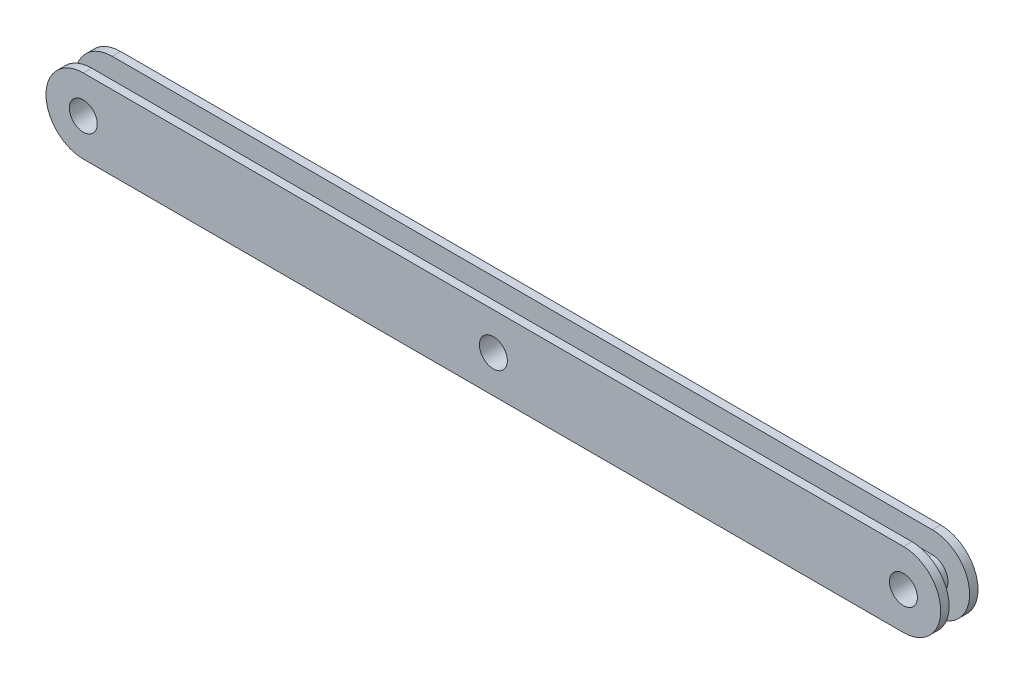
ISO-10303-21;
HEADER;
FILE_DESCRIPTION(('STEP AP214'),'2;1');
FILE_NAME('part.step','',(''),(''),'','','');
FILE_SCHEMA(('AUTOMOTIVE_DESIGN { 1 0 10303 214 1 1 1 1 }'));
ENDSEC;
DATA;
#1=APPLICATION_CONTEXT('core data for automotive mechanical design processes');
#2=APPLICATION_PROTOCOL_DEFINITION('international standard','automotive_design',2000,#1);
#3=PRODUCT_CONTEXT('',#1,'mechanical');
#4=PRODUCT('Part','Part','',(#3));
#5=PRODUCT_RELATED_PRODUCT_CATEGORY('part','',(#4));
#6=PRODUCT_DEFINITION_FORMATION('','',#4);
#7=PRODUCT_DEFINITION_CONTEXT('part definition',#1,'design');
#8=PRODUCT_DEFINITION('design','',#6,#7);
#9=PRODUCT_DEFINITION_SHAPE('','',#8);
#10=(LENGTH_UNIT() NAMED_UNIT(*) SI_UNIT(.MILLI.,.METRE.));
#11=(NAMED_UNIT(*) PLANE_ANGLE_UNIT() SI_UNIT($,.RADIAN.));
#12=(NAMED_UNIT(*) SI_UNIT($,.STERADIAN.) SOLID_ANGLE_UNIT());
#13=UNCERTAINTY_MEASURE_WITH_UNIT(LENGTH_MEASURE(1.E-05),#10,'distance_accuracy_value','');
#14=(GEOMETRIC_REPRESENTATION_CONTEXT(3) GLOBAL_UNCERTAINTY_ASSIGNED_CONTEXT((#13)) GLOBAL_UNIT_ASSIGNED_CONTEXT((#10,
#11,#12)) REPRESENTATION_CONTEXT('',''));
#15=CARTESIAN_POINT('',(0.,0.,0.));
#16=DIRECTION('',(0.,0.,1.));
#17=DIRECTION('',(1.,0.,0.));
#18=AXIS2_PLACEMENT_3D('',#15,#16,#17);
#19=CARTESIAN_POINT('',(0.,0.,-6.35));
#20=DIRECTION('',(0.,-1.,0.));
#21=DIRECTION('',(1.,0.,0.));
#22=AXIS2_PLACEMENT_3D('',#19,#20,#21);
#23=PLANE('',#22);
#24=DIRECTION('',(0.,0.,1.));
#25=VECTOR('',#24,1.);
#26=CARTESIAN_POINT('',(-146.05,0.,-6.35));
#27=LINE('',#26,#25);
#28=CARTESIAN_POINT('',(-146.05,0.,-1.427499939));
#29=VERTEX_POINT('',#28);
#30=CARTESIAN_POINT('',(-146.05,0.,0.));
#31=VERTEX_POINT('',#30);
#32=EDGE_CURVE('E137',#29,#31,#27,.T.);
#33=ORIENTED_EDGE('',*,*,#32,.F.);
#34=DIRECTION('',(1.,0.,0.));
#35=VECTOR('',#34,1.);
#36=CARTESIAN_POINT('',(-152.4,0.,-1.427499939));
#37=LINE('',#36,#35);
#38=CARTESIAN_POINT('',(-6.35000000000005,0.,-1.427499939));
#39=VERTEX_POINT('',#38);
#40=EDGE_CURVE('E225',#29,#39,#37,.T.);
#41=ORIENTED_EDGE('',*,*,#40,.T.);
#42=DIRECTION('',(0.,0.,1.));
#43=VECTOR('',#42,1.);
#44=CARTESIAN_POINT('',(-6.34999999999999,0.,-6.35));
#45=LINE('',#44,#43);
#46=CARTESIAN_POINT('',(-6.34999999999999,0.,0.));
#47=VERTEX_POINT('',#46);
#48=EDGE_CURVE('E289',#39,#47,#45,.T.);
#49=ORIENTED_EDGE('',*,*,#48,.T.);
#50=DIRECTION('',(1.,0.,0.));
#51=VECTOR('',#50,1.);
#52=CARTESIAN_POINT('',(0.,0.,0.));
#53=LINE('',#52,#51);
#54=EDGE_CURVE('E274',#31,#47,#53,.T.);
#55=ORIENTED_EDGE('',*,*,#54,.F.);
#56=EDGE_LOOP('',(#33,#41,#49,#55));
#57=FACE_BOUND('',#56,.T.);
#58=ADVANCED_FACE('F122',(#57),#23,.T.);
#59=CARTESIAN_POINT('',(-6.34999999999999,0.,-6.35));
#60=VERTEX_POINT('',#59);
#61=CARTESIAN_POINT('',(-6.35000000000005,0.,-4.922500061));
#62=VERTEX_POINT('',#61);
#63=EDGE_CURVE('E221',#60,#62,#45,.T.);
#64=ORIENTED_EDGE('',*,*,#63,.T.);
#65=DIRECTION('',(1.,0.,0.));
#66=VECTOR('',#65,1.);
#67=CARTESIAN_POINT('',(-152.4,0.,-4.922500061));
#68=LINE('',#67,#66);
#69=CARTESIAN_POINT('',(-146.05,0.,-4.922500061));
#70=VERTEX_POINT('',#69);
#71=EDGE_CURVE('E213',#70,#62,#68,.T.);
#72=ORIENTED_EDGE('',*,*,#71,.F.);
#73=CARTESIAN_POINT('',(-146.05,0.,-6.35));
#74=VERTEX_POINT('',#73);
#75=EDGE_CURVE('E218',#74,#70,#27,.T.);
#76=ORIENTED_EDGE('',*,*,#75,.F.);
#77=DIRECTION('',(1.,0.,0.));
#78=VECTOR('',#77,1.);
#79=CARTESIAN_POINT('',(0.,0.,-6.35));
#80=LINE('',#79,#78);
#81=EDGE_CURVE('E273',#74,#60,#80,.T.);
#82=ORIENTED_EDGE('',*,*,#81,.T.);
#83=EDGE_LOOP('',(#64,#72,#76,#82));
#84=FACE_BOUND('',#83,.T.);
#85=ADVANCED_FACE('F215',(#84),#23,.T.);
#86=CARTESIAN_POINT('',(-152.4,12.7,-6.35));
#87=DIRECTION('',(0.,1.,0.));
#88=DIRECTION('',(-1.,0.,0.));
#89=AXIS2_PLACEMENT_3D('',#86,#87,#88);
#90=PLANE('',#89);
#91=DIRECTION('',(1.,0.,0.));
#92=VECTOR('',#91,1.);
#93=CARTESIAN_POINT('',(-152.4,12.7,-1.427499939));
#94=LINE('',#93,#92);
#95=CARTESIAN_POINT('',(-146.05,12.7,-1.427499939));
#96=VERTEX_POINT('',#95);
#97=CARTESIAN_POINT('',(-6.35000000000008,12.7,-1.427499939));
#98=VERTEX_POINT('',#97);
#99=EDGE_CURVE('E285',#96,#98,#94,.T.);
#100=ORIENTED_EDGE('',*,*,#99,.F.);
#101=DIRECTION('',(0.,0.,1.));
#102=VECTOR('',#101,1.);
#103=CARTESIAN_POINT('',(-146.05,12.7,-6.35));
#104=LINE('',#103,#102);
#105=CARTESIAN_POINT('',(-146.05,12.7,0.));
#106=VERTEX_POINT('',#105);
#107=EDGE_CURVE('E294',#96,#106,#104,.T.);
#108=ORIENTED_EDGE('',*,*,#107,.T.);
#109=DIRECTION('',(-1.,0.,0.));
#110=VECTOR('',#109,1.);
#111=CARTESIAN_POINT('',(-152.4,12.7,0.));
#112=LINE('',#111,#110);
#113=CARTESIAN_POINT('',(-6.35,12.7,0.));
#114=VERTEX_POINT('',#113);
#115=EDGE_CURVE('E250',#114,#106,#112,.T.);
#116=ORIENTED_EDGE('',*,*,#115,.F.);
#117=DIRECTION('',(0.,0.,1.));
#118=VECTOR('',#117,1.);
#119=CARTESIAN_POINT('',(-6.35,12.7,-6.35));
#120=LINE('',#119,#118);
#121=EDGE_CURVE('E145',#98,#114,#120,.T.);
#122=ORIENTED_EDGE('',*,*,#121,.F.);
#123=EDGE_LOOP('',(#100,#108,#116,#122));
#124=FACE_BOUND('',#123,.T.);
#125=ADVANCED_FACE('F363',(#124),#90,.T.);
#126=CARTESIAN_POINT('',(-6.35,6.34999999999998,-6.35));
#127=DIRECTION('',(0.,0.,1.));
#128=DIRECTION('',(1.,0.,0.));
#129=AXIS2_PLACEMENT_3D('',#126,#127,#128);
#130=CYLINDRICAL_SURFACE('',#129,6.35);
#131=CARTESIAN_POINT('',(-6.35,6.34999999999998,-4.922500061));
#132=DIRECTION('',(0.,0.,1.));
#133=DIRECTION('',(1.,0.,0.));
#134=AXIS2_PLACEMENT_3D('',#131,#132,#133);
#135=CIRCLE('',#134,6.35);
#136=CARTESIAN_POINT('',(-6.35000000000008,12.7,-4.922500061));
#137=VERTEX_POINT('',#136);
#138=EDGE_CURVE('E12',#62,#137,#135,.T.);
#139=ORIENTED_EDGE('',*,*,#138,.F.);
#140=ORIENTED_EDGE('',*,*,#63,.F.);
#141=CARTESIAN_POINT('',(-6.35,6.34999999999998,-6.35));
#142=DIRECTION('',(0.,0.,1.));
#143=DIRECTION('',(1.,0.,0.));
#144=AXIS2_PLACEMENT_3D('',#141,#142,#143);
#145=CIRCLE('',#144,6.35);
#146=CARTESIAN_POINT('',(-6.35,12.7,-6.35));
#147=VERTEX_POINT('',#146);
#148=EDGE_CURVE('E241',#147,#60,#145,.F.);
#149=ORIENTED_EDGE('',*,*,#148,.F.);
#150=EDGE_CURVE('E256',#147,#137,#120,.T.);
#151=ORIENTED_EDGE('',*,*,#150,.T.);
#152=EDGE_LOOP('',(#139,#140,#149,#151));
#153=FACE_BOUND('',#152,.T.);
#154=ADVANCED_FACE('F381',(#153),#130,.T.);
#155=CARTESIAN_POINT('',(-6.35,6.34999999999998,-1.427499939));
#156=DIRECTION('',(0.,0.,-1.));
#157=DIRECTION('',(-1.,0.,0.));
#158=AXIS2_PLACEMENT_3D('',#155,#156,#157);
#159=CIRCLE('',#158,6.35);
#160=EDGE_CURVE('E130',#98,#39,#159,.T.);
#161=ORIENTED_EDGE('',*,*,#160,.F.);
#162=ORIENTED_EDGE('',*,*,#121,.T.);
#163=CARTESIAN_POINT('',(-6.35,6.34999999999998,0.));
#164=DIRECTION('',(0.,0.,1.));
#165=DIRECTION('',(1.,0.,0.));
#166=AXIS2_PLACEMENT_3D('',#163,#164,#165);
#167=CIRCLE('',#166,6.35);
#168=EDGE_CURVE('E239',#114,#47,#167,.F.);
#169=ORIENTED_EDGE('',*,*,#168,.T.);
#170=ORIENTED_EDGE('',*,*,#48,.F.);
#171=EDGE_LOOP('',(#161,#162,#169,#170));
#172=FACE_BOUND('',#171,.T.);
#173=ADVANCED_FACE('F291',(#172),#130,.T.);
#174=CARTESIAN_POINT('',(-146.05,6.34999999999998,-6.35));
#175=DIRECTION('',(0.,0.,1.));
#176=DIRECTION('',(1.,0.,0.));
#177=AXIS2_PLACEMENT_3D('',#174,#175,#176);
#178=CYLINDRICAL_SURFACE('',#177,6.35);
#179=ORIENTED_EDGE('',*,*,#75,.T.);
#180=CARTESIAN_POINT('',(-146.05,6.34999999999998,-4.922500061));
#181=DIRECTION('',(0.,0.,1.));
#182=DIRECTION('',(1.,0.,0.));
#183=AXIS2_PLACEMENT_3D('',#180,#181,#182);
#184=CIRCLE('',#183,6.35);
#185=CARTESIAN_POINT('',(-146.05,12.7,-4.922500061));
#186=VERTEX_POINT('',#185);
#187=EDGE_CURVE('E228',#70,#186,#184,.F.);
#188=ORIENTED_EDGE('',*,*,#187,.T.);
#189=CARTESIAN_POINT('',(-146.05,12.7,-6.35));
#190=VERTEX_POINT('',#189);
#191=EDGE_CURVE('E292',#190,#186,#104,.T.);
#192=ORIENTED_EDGE('',*,*,#191,.F.);
#193=CARTESIAN_POINT('',(-146.05,6.34999999999998,-6.35));
#194=DIRECTION('',(0.,0.,1.));
#195=DIRECTION('',(1.,0.,0.));
#196=AXIS2_PLACEMENT_3D('',#193,#194,#195);
#197=CIRCLE('',#196,6.35);
#198=EDGE_CURVE('E238',#190,#74,#197,.T.);
#199=ORIENTED_EDGE('',*,*,#198,.T.);
#200=EDGE_LOOP('',(#179,#188,#192,#199));
#201=FACE_BOUND('',#200,.T.);
#202=ADVANCED_FACE('F237',(#201),#178,.T.);
#203=ORIENTED_EDGE('',*,*,#107,.F.);
#204=CARTESIAN_POINT('',(-146.05,6.34999999999998,-1.427499939));
#205=DIRECTION('',(0.,0.,-1.));
#206=DIRECTION('',(-1.,0.,0.));
#207=AXIS2_PLACEMENT_3D('',#204,#205,#206);
#208=CIRCLE('',#207,6.35);
#209=EDGE_CURVE('E235',#96,#29,#208,.F.);
#210=ORIENTED_EDGE('',*,*,#209,.T.);
#211=ORIENTED_EDGE('',*,*,#32,.T.);
#212=CARTESIAN_POINT('',(-146.05,6.34999999999998,0.));
#213=DIRECTION('',(0.,0.,1.));
#214=DIRECTION('',(1.,0.,0.));
#215=AXIS2_PLACEMENT_3D('',#212,#213,#214);
#216=CIRCLE('',#215,6.35);
#217=EDGE_CURVE('E245',#106,#31,#216,.T.);
#218=ORIENTED_EDGE('',*,*,#217,.F.);
#219=EDGE_LOOP('',(#203,#210,#211,#218));
#220=FACE_BOUND('',#219,.T.);
#221=ADVANCED_FACE('F303',(#220),#178,.T.);
#222=DIRECTION('',(1.,0.,0.));
#223=VECTOR('',#222,1.);
#224=CARTESIAN_POINT('',(-152.4,12.7,-4.922500061));
#225=LINE('',#224,#223);
#226=EDGE_CURVE('E231',#186,#137,#225,.T.);
#227=ORIENTED_EDGE('',*,*,#226,.T.);
#228=ORIENTED_EDGE('',*,*,#150,.F.);
#229=DIRECTION('',(-1.,0.,0.));
#230=VECTOR('',#229,1.);
#231=CARTESIAN_POINT('',(-152.4,12.7,-6.35));
#232=LINE('',#231,#230);
#233=EDGE_CURVE('E270',#147,#190,#232,.T.);
#234=ORIENTED_EDGE('',*,*,#233,.T.);
#235=ORIENTED_EDGE('',*,*,#191,.T.);
#236=EDGE_LOOP('',(#227,#228,#234,#235));
#237=FACE_BOUND('',#236,.T.);
#238=ADVANCED_FACE('F124',(#237),#90,.T.);
#239=CARTESIAN_POINT('',(0.,0.,-6.35));
#240=DIRECTION('',(0.,0.,-1.));
#241=DIRECTION('',(-1.,0.,0.));
#242=AXIS2_PLACEMENT_3D('',#239,#240,#241);
#243=PLANE('',#242);
#244=ORIENTED_EDGE('',*,*,#148,.T.);
#245=ORIENTED_EDGE('',*,*,#81,.F.);
#246=ORIENTED_EDGE('',*,*,#198,.F.);
#247=ORIENTED_EDGE('',*,*,#233,.F.);
#248=EDGE_LOOP('',(#244,#245,#246,#247));
#249=FACE_BOUND('',#248,.T.);
#250=CARTESIAN_POINT('',(-76.2,6.34999999999998,-6.35));
#251=DIRECTION('',(0.,0.,1.));
#252=DIRECTION('',(1.,0.,0.));
#253=AXIS2_PLACEMENT_3D('',#250,#251,#252);
#254=CIRCLE('',#253,2.38125000000001);
#255=CARTESIAN_POINT('',(-73.81875,6.34999999999998,-6.35));
#256=VERTEX_POINT('',#255);
#257=EDGE_CURVE('E254',#256,#256,#254,.T.);
#258=ORIENTED_EDGE('',*,*,#257,.T.);
#259=EDGE_LOOP('',(#258));
#260=FACE_BOUND('',#259,.T.);
#261=CARTESIAN_POINT('',(-6.35,6.34999999999998,-6.35));
#262=DIRECTION('',(0.,0.,1.));
#263=DIRECTION('',(1.,0.,0.));
#264=AXIS2_PLACEMENT_3D('',#261,#262,#263);
#265=CIRCLE('',#264,2.38125);
#266=CARTESIAN_POINT('',(-3.96875,6.34999999999998,-6.35));
#267=VERTEX_POINT('',#266);
#268=EDGE_CURVE('E265',#267,#267,#265,.T.);
#269=ORIENTED_EDGE('',*,*,#268,.T.);
#270=EDGE_LOOP('',(#269));
#271=FACE_BOUND('',#270,.T.);
#272=CARTESIAN_POINT('',(-146.05,6.34999999999998,-6.35));
#273=DIRECTION('',(0.,0.,1.));
#274=DIRECTION('',(1.,0.,0.));
#275=AXIS2_PLACEMENT_3D('',#272,#273,#274);
#276=CIRCLE('',#275,2.38125000000001);
#277=CARTESIAN_POINT('',(-143.66875,6.34999999999998,-6.35));
#278=VERTEX_POINT('',#277);
#279=EDGE_CURVE('E247',#278,#278,#276,.T.);
#280=ORIENTED_EDGE('',*,*,#279,.T.);
#281=EDGE_LOOP('',(#280));
#282=FACE_BOUND('',#281,.T.);
#283=ADVANCED_FACE('F368',(#249,#260,#271,#282),#243,.T.);
#284=CARTESIAN_POINT('',(0.,0.,0.));
#285=DIRECTION('',(0.,0.,-1.));
#286=DIRECTION('',(-1.,0.,0.));
#287=AXIS2_PLACEMENT_3D('',#284,#285,#286);
#288=PLANE('',#287);
#289=CARTESIAN_POINT('',(-76.2,6.34999999999998,0.));
#290=DIRECTION('',(0.,0.,1.));
#291=DIRECTION('',(1.,0.,0.));
#292=AXIS2_PLACEMENT_3D('',#289,#290,#291);
#293=CIRCLE('',#292,2.38125000000001);
#294=CARTESIAN_POINT('',(-73.81875,6.34999999999998,0.));
#295=VERTEX_POINT('',#294);
#296=EDGE_CURVE('E262',#295,#295,#293,.T.);
#297=ORIENTED_EDGE('',*,*,#296,.F.);
#298=EDGE_LOOP('',(#297));
#299=FACE_BOUND('',#298,.T.);
#300=CARTESIAN_POINT('',(-6.35,6.34999999999998,0.));
#301=DIRECTION('',(0.,0.,1.));
#302=DIRECTION('',(1.,0.,0.));
#303=AXIS2_PLACEMENT_3D('',#300,#301,#302);
#304=CIRCLE('',#303,2.38125);
#305=CARTESIAN_POINT('',(-3.96875,6.34999999999998,0.));
#306=VERTEX_POINT('',#305);
#307=EDGE_CURVE('E259',#306,#306,#304,.T.);
#308=ORIENTED_EDGE('',*,*,#307,.F.);
#309=EDGE_LOOP('',(#308));
#310=FACE_BOUND('',#309,.T.);
#311=CARTESIAN_POINT('',(-146.05,6.34999999999998,0.));
#312=DIRECTION('',(0.,0.,1.));
#313=DIRECTION('',(1.,0.,0.));
#314=AXIS2_PLACEMENT_3D('',#311,#312,#313);
#315=CIRCLE('',#314,2.38125000000001);
#316=CARTESIAN_POINT('',(-143.66875,6.34999999999998,0.));
#317=VERTEX_POINT('',#316);
#318=EDGE_CURVE('E251',#317,#317,#315,.T.);
#319=ORIENTED_EDGE('',*,*,#318,.F.);
#320=EDGE_LOOP('',(#319));
#321=FACE_BOUND('',#320,.T.);
#322=ORIENTED_EDGE('',*,*,#54,.T.);
#323=ORIENTED_EDGE('',*,*,#168,.F.);
#324=ORIENTED_EDGE('',*,*,#115,.T.);
#325=ORIENTED_EDGE('',*,*,#217,.T.);
#326=EDGE_LOOP('',(#322,#323,#324,#325));
#327=FACE_BOUND('',#326,.T.);
#328=ADVANCED_FACE('F300',(#299,#310,#321,#327),#288,.F.);
#329=CARTESIAN_POINT('',(-146.05,6.34999999999998,-6.35));
#330=DIRECTION('',(0.,0.,1.));
#331=DIRECTION('',(1.,0.,0.));
#332=AXIS2_PLACEMENT_3D('',#329,#330,#331);
#333=CYLINDRICAL_SURFACE('',#332,2.38125000000001);
#334=ORIENTED_EDGE('',*,*,#279,.F.);
#335=EDGE_LOOP('',(#334));
#336=FACE_BOUND('',#335,.T.);
#337=ORIENTED_EDGE('',*,*,#318,.T.);
#338=EDGE_LOOP('',(#337));
#339=FACE_BOUND('',#338,.T.);
#340=ADVANCED_FACE('F367',(#336,#339),#333,.F.);
#341=CARTESIAN_POINT('',(-6.35,6.34999999999998,-6.35));
#342=DIRECTION('',(0.,0.,1.));
#343=DIRECTION('',(1.,0.,0.));
#344=AXIS2_PLACEMENT_3D('',#341,#342,#343);
#345=CYLINDRICAL_SURFACE('',#344,2.38125);
#346=ORIENTED_EDGE('',*,*,#268,.F.);
#347=EDGE_LOOP('',(#346));
#348=FACE_BOUND('',#347,.T.);
#349=ORIENTED_EDGE('',*,*,#307,.T.);
#350=EDGE_LOOP('',(#349));
#351=FACE_BOUND('',#350,.T.);
#352=ADVANCED_FACE('F373',(#348,#351),#345,.F.);
#353=CARTESIAN_POINT('',(-76.2,6.34999999999998,-6.35));
#354=DIRECTION('',(0.,0.,1.));
#355=DIRECTION('',(1.,0.,0.));
#356=AXIS2_PLACEMENT_3D('',#353,#354,#355);
#357=CYLINDRICAL_SURFACE('',#356,2.38125000000001);
#358=ORIENTED_EDGE('',*,*,#257,.F.);
#359=EDGE_LOOP('',(#358));
#360=FACE_BOUND('',#359,.T.);
#361=ORIENTED_EDGE('',*,*,#296,.T.);
#362=EDGE_LOOP('',(#361));
#363=FACE_BOUND('',#362,.T.);
#364=ADVANCED_FACE('F376',(#360,#363),#357,.F.);
#365=CARTESIAN_POINT('',(-146.050000000001,152.4,-4.922500061));
#366=DIRECTION('',(0.,0.,1.));
#367=DIRECTION('',(1.,0.,0.));
#368=AXIS2_PLACEMENT_3D('',#365,#366,#367);
#369=PLANE('',#368);
#370=DIRECTION('',(1.,0.,0.));
#371=VECTOR('',#370,1.);
#372=CARTESIAN_POINT('',(-152.4,3.68299999999997,-4.922500061));
#373=LINE('',#372,#371);
#374=CARTESIAN_POINT('',(-146.05,3.68299999999997,-4.922500061));
#375=VERTEX_POINT('',#374);
#376=CARTESIAN_POINT('',(-6.34999999999999,3.68299999999997,-4.922500061));
#377=VERTEX_POINT('',#376);
#378=EDGE_CURVE('E224',#375,#377,#373,.T.);
#379=ORIENTED_EDGE('',*,*,#378,.F.);
#380=CARTESIAN_POINT('',(-146.05,6.34999999999999,-4.922500061));
#381=DIRECTION('',(0.,0.,-1.));
#382=DIRECTION('',(-1.,0.,0.));
#383=AXIS2_PLACEMENT_3D('',#380,#381,#382);
#384=CIRCLE('',#383,2.66700000000001);
#385=CARTESIAN_POINT('',(-146.05,9.017,-4.922500061));
#386=VERTEX_POINT('',#385);
#387=EDGE_CURVE('E306',#375,#386,#384,.T.);
#388=ORIENTED_EDGE('',*,*,#387,.T.);
#389=DIRECTION('',(1.,0.,0.));
#390=VECTOR('',#389,1.);
#391=CARTESIAN_POINT('',(-152.4,9.017,-4.922500061));
#392=LINE('',#391,#390);
#393=CARTESIAN_POINT('',(-6.35000000000005,9.017,-4.922500061));
#394=VERTEX_POINT('',#393);
#395=EDGE_CURVE('E334',#386,#394,#392,.T.);
#396=ORIENTED_EDGE('',*,*,#395,.T.);
#397=CARTESIAN_POINT('',(-6.34999999999999,6.34999999999999,-4.922500061));
#398=DIRECTION('',(0.,0.,1.));
#399=DIRECTION('',(1.,0.,0.));
#400=AXIS2_PLACEMENT_3D('',#397,#398,#399);
#401=CIRCLE('',#400,2.66700000000001);
#402=EDGE_CURVE('E324',#377,#394,#401,.T.);
#403=ORIENTED_EDGE('',*,*,#402,.F.);
#404=EDGE_LOOP('',(#379,#388,#396,#403));
#405=FACE_BOUND('',#404,.T.);
#406=ORIENTED_EDGE('',*,*,#138,.T.);
#407=ORIENTED_EDGE('',*,*,#226,.F.);
#408=ORIENTED_EDGE('',*,*,#187,.F.);
#409=ORIENTED_EDGE('',*,*,#71,.T.);
#410=EDGE_LOOP('',(#406,#407,#408,#409));
#411=FACE_BOUND('',#410,.T.);
#412=ADVANCED_FACE('F229',(#405,#411),#369,.T.);
#413=CARTESIAN_POINT('',(-146.050000000001,152.4,-1.427499939));
#414=DIRECTION('',(0.,0.,-1.));
#415=DIRECTION('',(-1.,0.,0.));
#416=AXIS2_PLACEMENT_3D('',#413,#414,#415);
#417=PLANE('',#416);
#418=DIRECTION('',(1.,0.,0.));
#419=VECTOR('',#418,1.);
#420=CARTESIAN_POINT('',(-152.4,3.68299999999997,-1.427499939));
#421=LINE('',#420,#419);
#422=CARTESIAN_POINT('',(-146.05,3.68299999999997,-1.427499939));
#423=VERTEX_POINT('',#422);
#424=CARTESIAN_POINT('',(-6.35000000000005,3.68299999999999,-1.427499939));
#425=VERTEX_POINT('',#424);
#426=EDGE_CURVE('E335',#423,#425,#421,.T.);
#427=ORIENTED_EDGE('',*,*,#426,.T.);
#428=CARTESIAN_POINT('',(-6.34999999999999,6.34999999999999,-1.427499939));
#429=DIRECTION('',(0.,0.,1.));
#430=DIRECTION('',(1.,0.,0.));
#431=AXIS2_PLACEMENT_3D('',#428,#429,#430);
#432=CIRCLE('',#431,2.66700000000001);
#433=CARTESIAN_POINT('',(-6.34999999999999,9.017,-1.427499939));
#434=VERTEX_POINT('',#433);
#435=EDGE_CURVE('E321',#425,#434,#432,.T.);
#436=ORIENTED_EDGE('',*,*,#435,.T.);
#437=DIRECTION('',(1.,0.,0.));
#438=VECTOR('',#437,1.);
#439=CARTESIAN_POINT('',(-152.4,9.017,-1.427499939));
#440=LINE('',#439,#438);
#441=CARTESIAN_POINT('',(-146.05,9.017,-1.427499939));
#442=VERTEX_POINT('',#441);
#443=EDGE_CURVE('E332',#442,#434,#440,.T.);
#444=ORIENTED_EDGE('',*,*,#443,.F.);
#445=CARTESIAN_POINT('',(-146.05,6.34999999999999,-1.427499939));
#446=DIRECTION('',(0.,0.,-1.));
#447=DIRECTION('',(-1.,0.,0.));
#448=AXIS2_PLACEMENT_3D('',#445,#446,#447);
#449=CIRCLE('',#448,2.66700000000001);
#450=EDGE_CURVE('E297',#423,#442,#449,.T.);
#451=ORIENTED_EDGE('',*,*,#450,.F.);
#452=EDGE_LOOP('',(#427,#436,#444,#451));
#453=FACE_BOUND('',#452,.T.);
#454=ORIENTED_EDGE('',*,*,#40,.F.);
#455=ORIENTED_EDGE('',*,*,#209,.F.);
#456=ORIENTED_EDGE('',*,*,#99,.T.);
#457=ORIENTED_EDGE('',*,*,#160,.T.);
#458=EDGE_LOOP('',(#454,#455,#456,#457));
#459=FACE_BOUND('',#458,.T.);
#460=ADVANCED_FACE('F283',(#453,#459),#417,.T.);
#461=CARTESIAN_POINT('',(-146.05,6.34999999999999,-6.35));
#462=DIRECTION('',(0.,0.,-1.));
#463=DIRECTION('',(-1.,0.,0.));
#464=AXIS2_PLACEMENT_3D('',#461,#462,#463);
#465=CYLINDRICAL_SURFACE('',#464,2.66700000000001);
#466=ORIENTED_EDGE('',*,*,#387,.F.);
#467=DIRECTION('',(0.,0.,1.));
#468=VECTOR('',#467,1.);
#469=CARTESIAN_POINT('',(-146.05,3.68299999999997,0.));
#470=LINE('',#469,#468);
#471=EDGE_CURVE('E312',#375,#423,#470,.T.);
#472=ORIENTED_EDGE('',*,*,#471,.T.);
#473=ORIENTED_EDGE('',*,*,#450,.T.);
#474=DIRECTION('',(0.,0.,1.));
#475=VECTOR('',#474,1.);
#476=CARTESIAN_POINT('',(-146.05,9.017,0.));
#477=LINE('',#476,#475);
#478=EDGE_CURVE('E317',#386,#442,#477,.T.);
#479=ORIENTED_EDGE('',*,*,#478,.F.);
#480=EDGE_LOOP('',(#466,#472,#473,#479));
#481=FACE_BOUND('',#480,.T.);
#482=ADVANCED_FACE('F351',(#481),#465,.T.);
#483=CARTESIAN_POINT('',(-6.34999999999999,6.34999999999999,-6.35));
#484=DIRECTION('',(0.,0.,-1.));
#485=DIRECTION('',(1.,0.,0.));
#486=AXIS2_PLACEMENT_3D('',#483,#484,#485);
#487=CYLINDRICAL_SURFACE('',#486,2.66700000000001);
#488=ORIENTED_EDGE('',*,*,#402,.T.);
#489=DIRECTION('',(0.,0.,1.));
#490=VECTOR('',#489,1.);
#491=CARTESIAN_POINT('',(-6.34999999999999,9.017,0.));
#492=LINE('',#491,#490);
#493=EDGE_CURVE('E329',#394,#434,#492,.T.);
#494=ORIENTED_EDGE('',*,*,#493,.T.);
#495=ORIENTED_EDGE('',*,*,#435,.F.);
#496=DIRECTION('',(0.,0.,1.));
#497=VECTOR('',#496,1.);
#498=CARTESIAN_POINT('',(-6.34999999999999,3.68299999999997,0.));
#499=LINE('',#498,#497);
#500=EDGE_CURVE('E327',#377,#425,#499,.T.);
#501=ORIENTED_EDGE('',*,*,#500,.F.);
#502=EDGE_LOOP('',(#488,#494,#495,#501));
#503=FACE_BOUND('',#502,.T.);
#504=ADVANCED_FACE('F347',(#503),#487,.T.);
#505=CARTESIAN_POINT('',(-152.4,9.017,-1.427499939));
#506=DIRECTION('',(0.,-1.,0.));
#507=DIRECTION('',(0.,0.,-1.));
#508=AXIS2_PLACEMENT_3D('',#505,#506,#507);
#509=PLANE('',#508);
#510=ORIENTED_EDGE('',*,*,#478,.T.);
#511=ORIENTED_EDGE('',*,*,#443,.T.);
#512=ORIENTED_EDGE('',*,*,#493,.F.);
#513=ORIENTED_EDGE('',*,*,#395,.F.);
#514=EDGE_LOOP('',(#510,#511,#512,#513));
#515=FACE_BOUND('',#514,.T.);
#516=ADVANCED_FACE('F350',(#515),#509,.F.);
#517=CARTESIAN_POINT('',(-152.4,3.68299999999997,-1.427499939));
#518=DIRECTION('',(0.,-1.,0.));
#519=DIRECTION('',(1.,0.,0.));
#520=AXIS2_PLACEMENT_3D('',#517,#518,#519);
#521=PLANE('',#520);
#522=ORIENTED_EDGE('',*,*,#378,.T.);
#523=ORIENTED_EDGE('',*,*,#500,.T.);
#524=ORIENTED_EDGE('',*,*,#426,.F.);
#525=ORIENTED_EDGE('',*,*,#471,.F.);
#526=EDGE_LOOP('',(#522,#523,#524,#525));
#527=FACE_BOUND('',#526,.T.);
#528=ADVANCED_FACE('F352',(#527),#521,.T.);
#529=CLOSED_SHELL('',(#58,#85,#125,#154,#173,#202,#221,#238,#283,#328,#340,#352,#364,#412,#460,
#482,#504,#516,#528));
#530=MANIFOLD_SOLID_BREP('B2',#529);
#531=ADVANCED_BREP_SHAPE_REPRESENTATION('',(#18,#530),#14);
#532=SHAPE_DEFINITION_REPRESENTATION(#9,#531);
ENDSEC;
END-ISO-10303-21;
